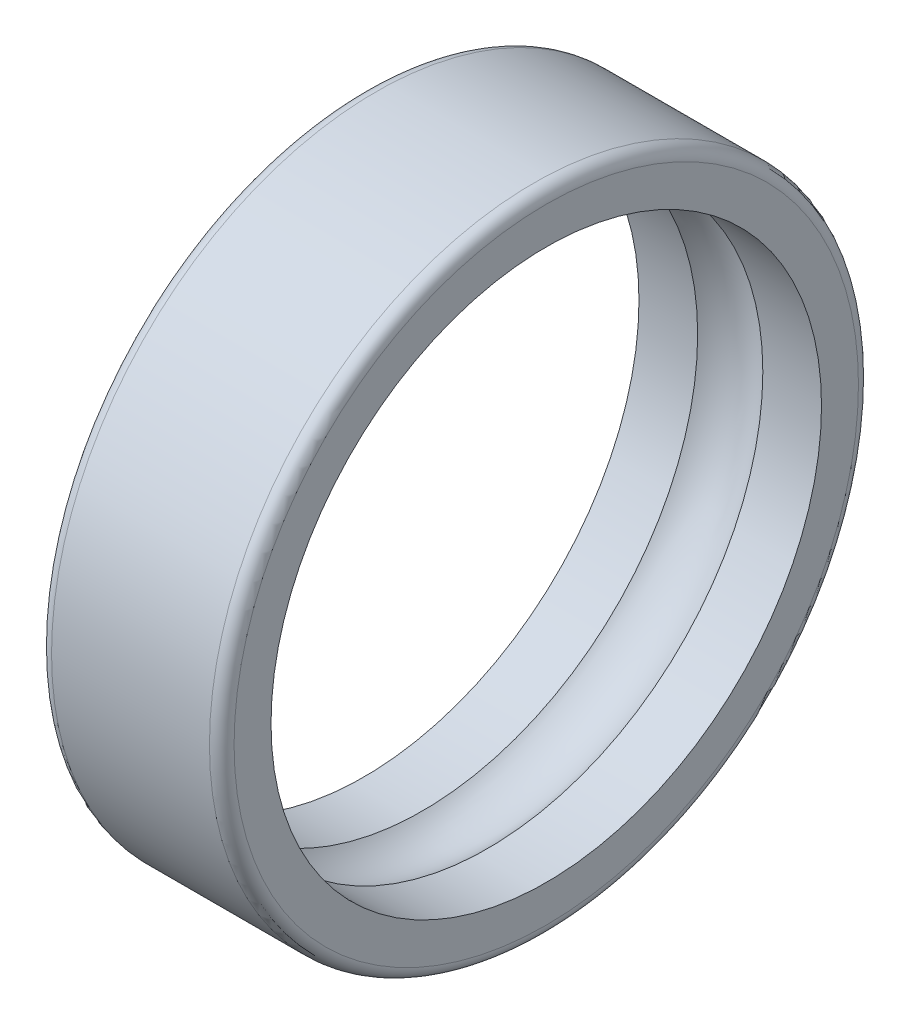
ISO-10303-21;
HEADER;
FILE_DESCRIPTION(('STEP AP214'),'2;1');
FILE_NAME('part.step','',(''),(''),'','','');
FILE_SCHEMA(('AUTOMOTIVE_DESIGN { 1 0 10303 214 1 1 1 1 }'));
ENDSEC;
DATA;
#1=APPLICATION_CONTEXT('core data for automotive mechanical design processes');
#2=APPLICATION_PROTOCOL_DEFINITION('international standard','automotive_design',2000,#1);
#3=PRODUCT_CONTEXT('',#1,'mechanical');
#4=PRODUCT('Part','Part','',(#3));
#5=PRODUCT_RELATED_PRODUCT_CATEGORY('part','',(#4));
#6=PRODUCT_DEFINITION_FORMATION('','',#4);
#7=PRODUCT_DEFINITION_CONTEXT('part definition',#1,'design');
#8=PRODUCT_DEFINITION('design','',#6,#7);
#9=PRODUCT_DEFINITION_SHAPE('','',#8);
#10=(LENGTH_UNIT() NAMED_UNIT(*) SI_UNIT(.MILLI.,.METRE.));
#11=(NAMED_UNIT(*) PLANE_ANGLE_UNIT() SI_UNIT($,.RADIAN.));
#12=(NAMED_UNIT(*) SI_UNIT($,.STERADIAN.) SOLID_ANGLE_UNIT());
#13=UNCERTAINTY_MEASURE_WITH_UNIT(LENGTH_MEASURE(1.E-05),#10,'distance_accuracy_value','');
#14=(GEOMETRIC_REPRESENTATION_CONTEXT(3) GLOBAL_UNCERTAINTY_ASSIGNED_CONTEXT((#13)) GLOBAL_UNIT_ASSIGNED_CONTEXT((#10,
#11,#12)) REPRESENTATION_CONTEXT('',''));
#15=CARTESIAN_POINT('',(0.,0.,0.));
#16=DIRECTION('',(0.,0.,1.));
#17=DIRECTION('',(1.,0.,0.));
#18=AXIS2_PLACEMENT_3D('',#15,#16,#17);
#19=CARTESIAN_POINT('',(0.,0.,0.));
#20=DIRECTION('',(-1.,0.,0.));
#21=DIRECTION('',(0.,0.,1.));
#22=AXIS2_PLACEMENT_3D('',#19,#20,#21);
#23=CYLINDRICAL_SURFACE('',#22,13.5714285714286);
#24=CARTESIAN_POINT('',(4.5,0.,0.));
#25=DIRECTION('',(-1.,0.,0.));
#26=DIRECTION('',(0.,0.,1.));
#27=AXIS2_PLACEMENT_3D('',#24,#25,#26);
#28=CIRCLE('',#27,13.5714285714286);
#29=CARTESIAN_POINT('',(4.5,0.,13.5714285714286));
#30=VERTEX_POINT('',#29);
#31=EDGE_CURVE('E376',#30,#30,#28,.T.);
#32=ORIENTED_EDGE('',*,*,#31,.F.);
#33=EDGE_LOOP('',(#32));
#34=FACE_BOUND('',#33,.T.);
#35=CARTESIAN_POINT('',(1.60634901028921,0.,0.));
#36=DIRECTION('',(-1.,0.,0.));
#37=DIRECTION('',(0.,0.,1.));
#38=AXIS2_PLACEMENT_3D('',#35,#36,#37);
#39=CIRCLE('',#38,13.5714285714286);
#40=CARTESIAN_POINT('',(1.60634901028921,0.,13.5714285714286));
#41=VERTEX_POINT('',#40);
#42=EDGE_CURVE('E10',#41,#41,#39,.T.);
#43=ORIENTED_EDGE('',*,*,#42,.T.);
#44=EDGE_LOOP('',(#43));
#45=FACE_BOUND('',#44,.T.);
#46=ADVANCED_FACE('F348',(#34,#45),#23,.F.);
#47=CARTESIAN_POINT('',(0.,0.,0.));
#48=DIRECTION('',(-1.,0.,0.));
#49=DIRECTION('',(0.,0.,1.));
#50=AXIS2_PLACEMENT_3D('',#47,#48,#49);
#51=TOROIDAL_SURFACE('',#50,11.75,2.42857142857143);
#52=ORIENTED_EDGE('',*,*,#42,.F.);
#53=EDGE_LOOP('',(#52));
#54=FACE_BOUND('',#53,.T.);
#55=CARTESIAN_POINT('',(-1.60634901028921,0.,0.));
#56=DIRECTION('',(-1.,0.,0.));
#57=DIRECTION('',(0.,0.,1.));
#58=AXIS2_PLACEMENT_3D('',#55,#56,#57);
#59=CIRCLE('',#58,13.5714285714286);
#60=CARTESIAN_POINT('',(-1.60634901028921,0.,13.5714285714286));
#61=VERTEX_POINT('',#60);
#62=EDGE_CURVE('E354',#61,#61,#59,.T.);
#63=ORIENTED_EDGE('',*,*,#62,.T.);
#64=EDGE_LOOP('',(#63));
#65=FACE_BOUND('',#64,.T.);
#66=ADVANCED_FACE('F383',(#54,#65),#51,.F.);
#67=CARTESIAN_POINT('',(0.,0.,0.));
#68=DIRECTION('',(-1.,0.,0.));
#69=DIRECTION('',(0.,0.,1.));
#70=AXIS2_PLACEMENT_3D('',#67,#68,#69);
#71=CYLINDRICAL_SURFACE('',#70,13.5714285714286);
#72=ORIENTED_EDGE('',*,*,#62,.F.);
#73=EDGE_LOOP('',(#72));
#74=FACE_BOUND('',#73,.T.);
#75=CARTESIAN_POINT('',(-4.5,0.,0.));
#76=DIRECTION('',(-1.,0.,0.));
#77=DIRECTION('',(0.,0.,1.));
#78=AXIS2_PLACEMENT_3D('',#75,#76,#77);
#79=CIRCLE('',#78,13.5714285714286);
#80=CARTESIAN_POINT('',(-4.5,0.,13.5714285714286));
#81=VERTEX_POINT('',#80);
#82=EDGE_CURVE('E358',#81,#81,#79,.T.);
#83=ORIENTED_EDGE('',*,*,#82,.T.);
#84=EDGE_LOOP('',(#83));
#85=FACE_BOUND('',#84,.T.);
#86=ADVANCED_FACE('F387',(#74,#85),#71,.F.);
#87=CARTESIAN_POINT('',(-4.5,15.3928571428571,0.));
#88=DIRECTION('',(1.,0.,0.));
#89=DIRECTION('',(0.,0.,-1.));
#90=AXIS2_PLACEMENT_3D('',#87,#88,#89);
#91=PLANE('',#90);
#92=ORIENTED_EDGE('',*,*,#82,.F.);
#93=EDGE_LOOP('',(#92));
#94=FACE_BOUND('',#93,.T.);
#95=CARTESIAN_POINT('',(-4.5,0.,0.));
#96=DIRECTION('',(-1.,0.,0.));
#97=DIRECTION('',(0.,0.,1.));
#98=AXIS2_PLACEMENT_3D('',#95,#96,#97);
#99=CIRCLE('',#98,15.3928571428571);
#100=CARTESIAN_POINT('',(-4.5,0.,15.3928571428571));
#101=VERTEX_POINT('',#100);
#102=EDGE_CURVE('E362',#101,#101,#99,.T.);
#103=ORIENTED_EDGE('',*,*,#102,.T.);
#104=EDGE_LOOP('',(#103));
#105=FACE_BOUND('',#104,.T.);
#106=ADVANCED_FACE('F392',(#94,#105),#91,.F.);
#107=CARTESIAN_POINT('',(-3.89285714285714,0.,0.));
#108=DIRECTION('',(-1.,0.,0.));
#109=DIRECTION('',(0.,0.,1.));
#110=AXIS2_PLACEMENT_3D('',#107,#108,#109);
#111=TOROIDAL_SURFACE('',#110,15.3928571428571,0.607142857142856);
#112=ORIENTED_EDGE('',*,*,#102,.F.);
#113=EDGE_LOOP('',(#112));
#114=FACE_BOUND('',#113,.T.);
#115=CARTESIAN_POINT('',(-3.89285714285714,0.,0.));
#116=DIRECTION('',(-1.,0.,0.));
#117=DIRECTION('',(0.,0.,1.));
#118=AXIS2_PLACEMENT_3D('',#115,#116,#117);
#119=CIRCLE('',#118,16.);
#120=CARTESIAN_POINT('',(-3.89285714285714,0.,16.));
#121=VERTEX_POINT('',#120);
#122=EDGE_CURVE('E367',#121,#121,#119,.T.);
#123=ORIENTED_EDGE('',*,*,#122,.T.);
#124=EDGE_LOOP('',(#123));
#125=FACE_BOUND('',#124,.T.);
#126=ADVANCED_FACE('F398',(#114,#125),#111,.T.);
#127=CARTESIAN_POINT('',(0.,0.,0.));
#128=DIRECTION('',(-1.,0.,0.));
#129=DIRECTION('',(0.,0.,1.));
#130=AXIS2_PLACEMENT_3D('',#127,#128,#129);
#131=CYLINDRICAL_SURFACE('',#130,16.);
#132=ORIENTED_EDGE('',*,*,#122,.F.);
#133=EDGE_LOOP('',(#132));
#134=FACE_BOUND('',#133,.T.);
#135=CARTESIAN_POINT('',(3.89285714285714,0.,0.));
#136=DIRECTION('',(-1.,0.,0.));
#137=DIRECTION('',(0.,0.,1.));
#138=AXIS2_PLACEMENT_3D('',#135,#136,#137);
#139=CIRCLE('',#138,16.);
#140=CARTESIAN_POINT('',(3.89285714285714,0.,16.));
#141=VERTEX_POINT('',#140);
#142=EDGE_CURVE('E370',#141,#141,#139,.T.);
#143=ORIENTED_EDGE('',*,*,#142,.T.);
#144=EDGE_LOOP('',(#143));
#145=FACE_BOUND('',#144,.T.);
#146=ADVANCED_FACE('F402',(#134,#145),#131,.T.);
#147=CARTESIAN_POINT('',(3.89285714285714,0.,0.));
#148=DIRECTION('',(-1.,0.,0.));
#149=DIRECTION('',(0.,0.,1.));
#150=AXIS2_PLACEMENT_3D('',#147,#148,#149);
#151=TOROIDAL_SURFACE('',#150,15.3928571428571,0.607142857142856);
#152=ORIENTED_EDGE('',*,*,#142,.F.);
#153=EDGE_LOOP('',(#152));
#154=FACE_BOUND('',#153,.T.);
#155=CARTESIAN_POINT('',(4.5,0.,0.));
#156=DIRECTION('',(-1.,0.,0.));
#157=DIRECTION('',(0.,0.,1.));
#158=AXIS2_PLACEMENT_3D('',#155,#156,#157);
#159=CIRCLE('',#158,15.3928571428571);
#160=CARTESIAN_POINT('',(4.5,0.,15.3928571428571));
#161=VERTEX_POINT('',#160);
#162=EDGE_CURVE('E373',#161,#161,#159,.T.);
#163=ORIENTED_EDGE('',*,*,#162,.T.);
#164=EDGE_LOOP('',(#163));
#165=FACE_BOUND('',#164,.T.);
#166=ADVANCED_FACE('F406',(#154,#165),#151,.T.);
#167=CARTESIAN_POINT('',(4.5,15.3928571428571,0.));
#168=DIRECTION('',(-1.,0.,0.));
#169=DIRECTION('',(0.,0.,1.));
#170=AXIS2_PLACEMENT_3D('',#167,#168,#169);
#171=PLANE('',#170);
#172=ORIENTED_EDGE('',*,*,#162,.F.);
#173=EDGE_LOOP('',(#172));
#174=FACE_BOUND('',#173,.T.);
#175=ORIENTED_EDGE('',*,*,#31,.T.);
#176=EDGE_LOOP('',(#175));
#177=FACE_BOUND('',#176,.T.);
#178=ADVANCED_FACE('F380',(#174,#177),#171,.F.);
#179=CLOSED_SHELL('',(#46,#66,#86,#106,#126,#146,#166,#178));
#180=MANIFOLD_SOLID_BREP('B2',#179);
#181=ADVANCED_BREP_SHAPE_REPRESENTATION('',(#18,#180),#14);
#182=SHAPE_DEFINITION_REPRESENTATION(#9,#181);
ENDSEC;
END-ISO-10303-21;
